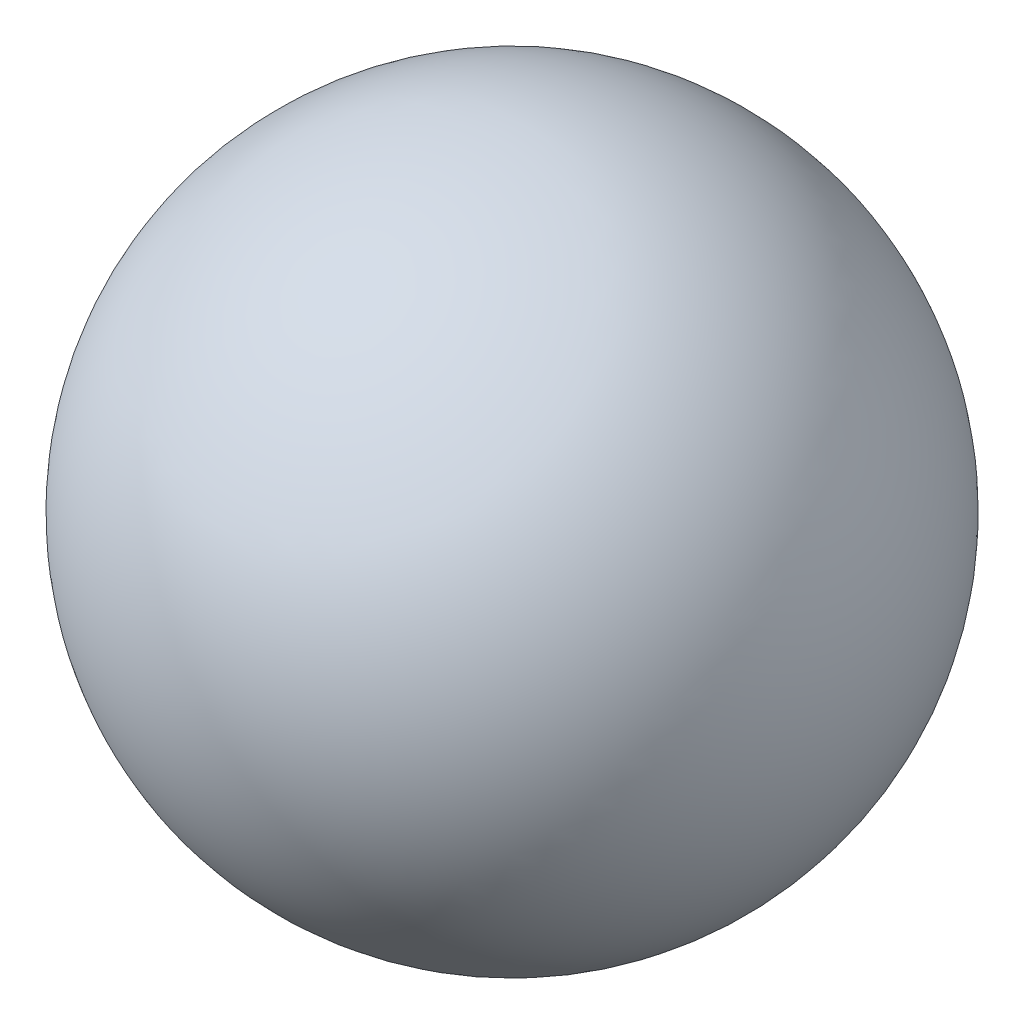
ISO-10303-21;
HEADER;
FILE_DESCRIPTION(('STEP AP214'),'2;1');
FILE_NAME('part.step','',(''),(''),'','','');
FILE_SCHEMA(('AUTOMOTIVE_DESIGN { 1 0 10303 214 1 1 1 1 }'));
ENDSEC;
DATA;
#1=APPLICATION_CONTEXT('core data for automotive mechanical design processes');
#2=APPLICATION_PROTOCOL_DEFINITION('international standard','automotive_design',2000,#1);
#3=PRODUCT_CONTEXT('',#1,'mechanical');
#4=PRODUCT('Part','Part','',(#3));
#5=PRODUCT_RELATED_PRODUCT_CATEGORY('part','',(#4));
#6=PRODUCT_DEFINITION_FORMATION('','',#4);
#7=PRODUCT_DEFINITION_CONTEXT('part definition',#1,'design');
#8=PRODUCT_DEFINITION('design','',#6,#7);
#9=PRODUCT_DEFINITION_SHAPE('','',#8);
#10=(LENGTH_UNIT() NAMED_UNIT(*) SI_UNIT(.MILLI.,.METRE.));
#11=(NAMED_UNIT(*) PLANE_ANGLE_UNIT() SI_UNIT($,.RADIAN.));
#12=(NAMED_UNIT(*) SI_UNIT($,.STERADIAN.) SOLID_ANGLE_UNIT());
#13=UNCERTAINTY_MEASURE_WITH_UNIT(LENGTH_MEASURE(1.E-05),#10,'distance_accuracy_value','');
#14=(GEOMETRIC_REPRESENTATION_CONTEXT(3) GLOBAL_UNCERTAINTY_ASSIGNED_CONTEXT((#13)) GLOBAL_UNIT_ASSIGNED_CONTEXT((#10,
#11,#12)) REPRESENTATION_CONTEXT('',''));
#15=CARTESIAN_POINT('',(0.,0.,0.));
#16=DIRECTION('',(0.,0.,1.));
#17=DIRECTION('',(1.,0.,0.));
#18=AXIS2_PLACEMENT_3D('',#15,#16,#17);
#19=CARTESIAN_POINT('',(0.,0.,0.));
#20=DIRECTION('',(0.,0.,1.));
#21=DIRECTION('',(-1.,0.,0.));
#22=AXIS2_PLACEMENT_3D('',#19,#20,#21);
#23=SPHERICAL_SURFACE('',#22,43.053);
#24=CARTESIAN_POINT('',(0.,0.,43.053));
#25=VERTEX_POINT('',#24);
#26=VERTEX_LOOP('',#25);
#27=FACE_BOUND('',#26,.T.);
#28=ADVANCED_FACE('F29',(#27),#23,.T.);
#29=CLOSED_SHELL('',(#28));
#30=MANIFOLD_SOLID_BREP('B2',#29);
#31=ADVANCED_BREP_SHAPE_REPRESENTATION('',(#18,#30),#14);
#32=SHAPE_DEFINITION_REPRESENTATION(#9,#31);
ENDSEC;
END-ISO-10303-21;
